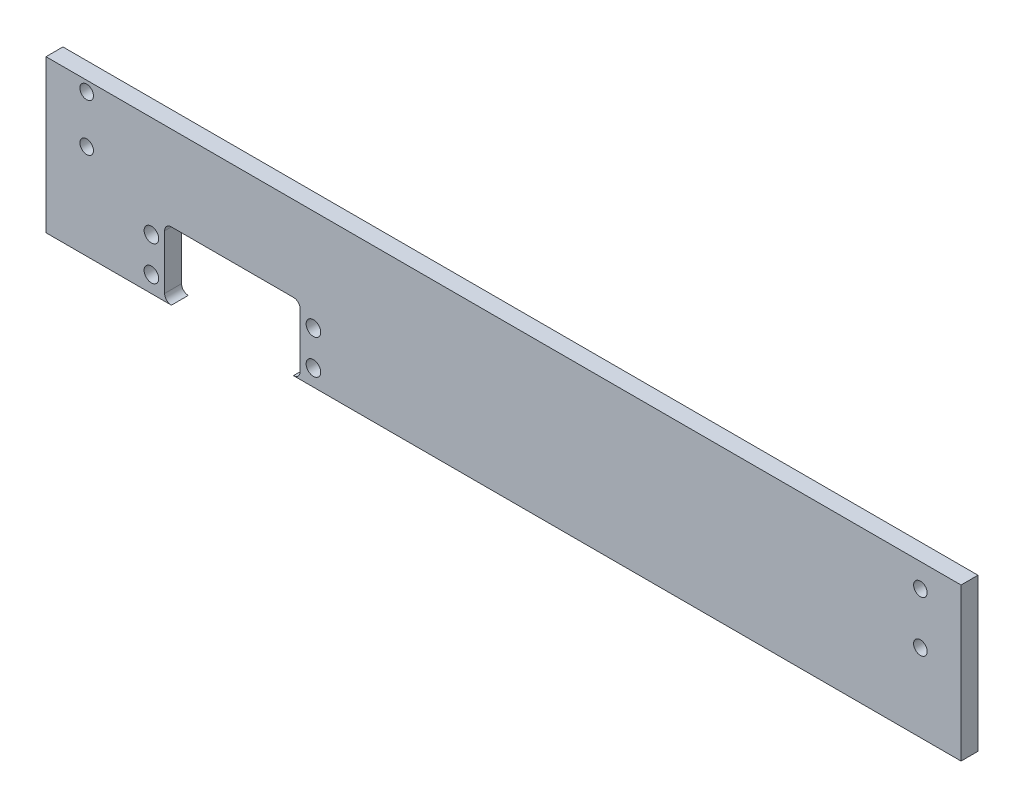
ISO-10303-21;
HEADER;
FILE_DESCRIPTION(('STEP AP214'),'2;1');
FILE_NAME('part.step','',(''),(''),'','','');
FILE_SCHEMA(('AUTOMOTIVE_DESIGN { 1 0 10303 214 1 1 1 1 }'));
ENDSEC;
DATA;
#1=APPLICATION_CONTEXT('core data for automotive mechanical design processes');
#2=APPLICATION_PROTOCOL_DEFINITION('international standard','automotive_design',2000,#1);
#3=PRODUCT_CONTEXT('',#1,'mechanical');
#4=PRODUCT('Part','Part','',(#3));
#5=PRODUCT_RELATED_PRODUCT_CATEGORY('part','',(#4));
#6=PRODUCT_DEFINITION_FORMATION('','',#4);
#7=PRODUCT_DEFINITION_CONTEXT('part definition',#1,'design');
#8=PRODUCT_DEFINITION('design','',#6,#7);
#9=PRODUCT_DEFINITION_SHAPE('','',#8);
#10=(LENGTH_UNIT() NAMED_UNIT(*) SI_UNIT(.MILLI.,.METRE.));
#11=(NAMED_UNIT(*) PLANE_ANGLE_UNIT() SI_UNIT($,.RADIAN.));
#12=(NAMED_UNIT(*) SI_UNIT($,.STERADIAN.) SOLID_ANGLE_UNIT());
#13=UNCERTAINTY_MEASURE_WITH_UNIT(LENGTH_MEASURE(1.E-05),#10,'distance_accuracy_value','');
#14=(GEOMETRIC_REPRESENTATION_CONTEXT(3) GLOBAL_UNCERTAINTY_ASSIGNED_CONTEXT((#13)) GLOBAL_UNIT_ASSIGNED_CONTEXT((#10,
#11,#12)) REPRESENTATION_CONTEXT('',''));
#15=CARTESIAN_POINT('',(0.,0.,0.));
#16=DIRECTION('',(0.,0.,1.));
#17=DIRECTION('',(1.,0.,0.));
#18=AXIS2_PLACEMENT_3D('',#15,#16,#17);
#19=CARTESIAN_POINT('',(-135.,-37.5,5.));
#20=DIRECTION('',(0.,1.,0.));
#21=DIRECTION('',(0.,0.,1.));
#22=AXIS2_PLACEMENT_3D('',#19,#20,#21);
#23=PLANE('',#22);
#24=DIRECTION('',(0.,0.,1.));
#25=VECTOR('',#24,1.);
#26=CARTESIAN_POINT('',(-62.,-37.5,0.));
#27=LINE('',#26,#25);
#28=CARTESIAN_POINT('',(-62.,-37.5,0.));
#29=VERTEX_POINT('',#28);
#30=CARTESIAN_POINT('',(-62.,-37.5,5.));
#31=VERTEX_POINT('',#30);
#32=EDGE_CURVE('E123',#29,#31,#27,.T.);
#33=ORIENTED_EDGE('',*,*,#32,.F.);
#34=DIRECTION('',(1.,0.,0.));
#35=VECTOR('',#34,1.);
#36=CARTESIAN_POINT('',(-135.,-37.5,0.));
#37=LINE('',#36,#35);
#38=CARTESIAN_POINT('',(135.,-37.5,0.));
#39=VERTEX_POINT('',#38);
#40=EDGE_CURVE('E119',#29,#39,#37,.T.);
#41=ORIENTED_EDGE('',*,*,#40,.T.);
#42=DIRECTION('',(0.,0.,-1.));
#43=VECTOR('',#42,1.);
#44=CARTESIAN_POINT('',(135.,-37.5,5.));
#45=LINE('',#44,#43);
#46=CARTESIAN_POINT('',(135.,-37.5,5.));
#47=VERTEX_POINT('',#46);
#48=EDGE_CURVE('E41',#47,#39,#45,.T.);
#49=ORIENTED_EDGE('',*,*,#48,.F.);
#50=DIRECTION('',(1.,0.,0.));
#51=VECTOR('',#50,1.);
#52=CARTESIAN_POINT('',(-135.,-37.5,5.));
#53=LINE('',#52,#51);
#54=EDGE_CURVE('E195',#31,#47,#53,.T.);
#55=ORIENTED_EDGE('',*,*,#54,.F.);
#56=EDGE_LOOP('',(#33,#41,#49,#55));
#57=FACE_BOUND('',#56,.T.);
#58=ADVANCED_FACE('F32',(#57),#23,.F.);
#59=CARTESIAN_POINT('',(135.,37.5,5.));
#60=DIRECTION('',(-1.,0.,0.));
#61=DIRECTION('',(0.,0.,1.));
#62=AXIS2_PLACEMENT_3D('',#59,#60,#61);
#63=PLANE('',#62);
#64=DIRECTION('',(0.,1.,0.));
#65=VECTOR('',#64,1.);
#66=CARTESIAN_POINT('',(135.,37.5,0.));
#67=LINE('',#66,#65);
#68=CARTESIAN_POINT('',(135.,7.50000000000001,0.));
#69=VERTEX_POINT('',#68);
#70=EDGE_CURVE('E130',#39,#69,#67,.T.);
#71=ORIENTED_EDGE('',*,*,#70,.T.);
#72=DIRECTION('',(0.,0.,-1.));
#73=VECTOR('',#72,1.);
#74=CARTESIAN_POINT('',(135.,7.50000000000001,0.));
#75=LINE('',#74,#73);
#76=CARTESIAN_POINT('',(135.,7.50000000000001,5.));
#77=VERTEX_POINT('',#76);
#78=EDGE_CURVE('E49',#77,#69,#75,.T.);
#79=ORIENTED_EDGE('',*,*,#78,.F.);
#80=DIRECTION('',(0.,1.,0.));
#81=VECTOR('',#80,1.);
#82=CARTESIAN_POINT('',(135.,37.5,5.));
#83=LINE('',#82,#81);
#84=EDGE_CURVE('E132',#47,#77,#83,.T.);
#85=ORIENTED_EDGE('',*,*,#84,.F.);
#86=ORIENTED_EDGE('',*,*,#48,.T.);
#87=EDGE_LOOP('',(#71,#79,#85,#86));
#88=FACE_BOUND('',#87,.T.);
#89=ADVANCED_FACE('F34',(#88),#63,.F.);
#90=CARTESIAN_POINT('',(-135.,37.5,5.));
#91=DIRECTION('',(1.,0.,0.));
#92=DIRECTION('',(0.,0.,-1.));
#93=AXIS2_PLACEMENT_3D('',#90,#91,#92);
#94=PLANE('',#93);
#95=DIRECTION('',(0.,-1.,0.));
#96=VECTOR('',#95,1.);
#97=CARTESIAN_POINT('',(-135.,37.5,5.));
#98=LINE('',#97,#96);
#99=CARTESIAN_POINT('',(-135.,7.50000000000001,5.));
#100=VERTEX_POINT('',#99);
#101=CARTESIAN_POINT('',(-135.,-37.5,5.));
#102=VERTEX_POINT('',#101);
#103=EDGE_CURVE('E194',#100,#102,#98,.T.);
#104=ORIENTED_EDGE('',*,*,#103,.F.);
#105=DIRECTION('',(0.,0.,1.));
#106=VECTOR('',#105,1.);
#107=CARTESIAN_POINT('',(-135.,7.50000000000001,0.));
#108=LINE('',#107,#106);
#109=CARTESIAN_POINT('',(-135.,7.50000000000001,0.));
#110=VERTEX_POINT('',#109);
#111=EDGE_CURVE('E261',#110,#100,#108,.T.);
#112=ORIENTED_EDGE('',*,*,#111,.F.);
#113=DIRECTION('',(0.,-1.,0.));
#114=VECTOR('',#113,1.);
#115=CARTESIAN_POINT('',(-135.,37.5,0.));
#116=LINE('',#115,#114);
#117=CARTESIAN_POINT('',(-135.,-37.5,0.));
#118=VERTEX_POINT('',#117);
#119=EDGE_CURVE('E114',#110,#118,#116,.T.);
#120=ORIENTED_EDGE('',*,*,#119,.T.);
#121=DIRECTION('',(0.,0.,-1.));
#122=VECTOR('',#121,1.);
#123=CARTESIAN_POINT('',(-135.,-37.5,5.));
#124=LINE('',#123,#122);
#125=EDGE_CURVE('E11',#102,#118,#124,.T.);
#126=ORIENTED_EDGE('',*,*,#125,.F.);
#127=EDGE_LOOP('',(#104,#112,#120,#126));
#128=FACE_BOUND('',#127,.T.);
#129=ADVANCED_FACE('F269',(#128),#94,.F.);
#130=CARTESIAN_POINT('',(-98.,-37.5,0.));
#131=VERTEX_POINT('',#130);
#132=EDGE_CURVE('E126',#118,#131,#37,.T.);
#133=ORIENTED_EDGE('',*,*,#132,.T.);
#134=DIRECTION('',(0.,0.,1.));
#135=VECTOR('',#134,1.);
#136=CARTESIAN_POINT('',(-98.,-37.5,0.));
#137=LINE('',#136,#135);
#138=CARTESIAN_POINT('',(-98.,-37.5,5.));
#139=VERTEX_POINT('',#138);
#140=EDGE_CURVE('E207',#131,#139,#137,.T.);
#141=ORIENTED_EDGE('',*,*,#140,.T.);
#142=EDGE_CURVE('E133',#102,#139,#53,.T.);
#143=ORIENTED_EDGE('',*,*,#142,.F.);
#144=ORIENTED_EDGE('',*,*,#125,.T.);
#145=EDGE_LOOP('',(#133,#141,#143,#144));
#146=FACE_BOUND('',#145,.T.);
#147=ADVANCED_FACE('F205',(#146),#23,.F.);
#148=CARTESIAN_POINT('',(0.,0.,5.));
#149=DIRECTION('',(0.,0.,1.));
#150=DIRECTION('',(1.,0.,0.));
#151=AXIS2_PLACEMENT_3D('',#148,#149,#150);
#152=PLANE('',#151);
#153=DIRECTION('',(1.,0.,0.));
#154=VECTOR('',#153,1.);
#155=CARTESIAN_POINT('',(135.,7.50000000000001,5.));
#156=LINE('',#155,#154);
#157=EDGE_CURVE('E257',#100,#77,#156,.T.);
#158=ORIENTED_EDGE('',*,*,#157,.F.);
#159=ORIENTED_EDGE('',*,*,#103,.T.);
#160=ORIENTED_EDGE('',*,*,#142,.T.);
#161=CARTESIAN_POINT('',(-98.,-35.5,5.));
#162=DIRECTION('',(0.,0.,1.));
#163=DIRECTION('',(1.,0.,0.));
#164=AXIS2_PLACEMENT_3D('',#161,#162,#163);
#165=CIRCLE('',#164,2.);
#166=CARTESIAN_POINT('',(-100.,-35.5,5.));
#167=VERTEX_POINT('',#166);
#168=EDGE_CURVE('E158',#167,#139,#165,.T.);
#169=ORIENTED_EDGE('',*,*,#168,.F.);
#170=DIRECTION('',(0.,1.,0.));
#171=VECTOR('',#170,1.);
#172=CARTESIAN_POINT('',(-100.,-19.5,5.));
#173=LINE('',#172,#171);
#174=CARTESIAN_POINT('',(-100.,-19.5,5.));
#175=VERTEX_POINT('',#174);
#176=EDGE_CURVE('E157',#175,#167,#173,.F.);
#177=ORIENTED_EDGE('',*,*,#176,.F.);
#178=CARTESIAN_POINT('',(-98.,-19.5,5.));
#179=DIRECTION('',(0.,0.,1.));
#180=DIRECTION('',(1.,0.,0.));
#181=AXIS2_PLACEMENT_3D('',#178,#179,#180);
#182=CIRCLE('',#181,2.);
#183=CARTESIAN_POINT('',(-98.,-17.5,5.));
#184=VERTEX_POINT('',#183);
#185=EDGE_CURVE('E155',#184,#175,#182,.T.);
#186=ORIENTED_EDGE('',*,*,#185,.F.);
#187=DIRECTION('',(-1.,0.,0.));
#188=VECTOR('',#187,1.);
#189=CARTESIAN_POINT('',(-62.,-17.5,5.));
#190=LINE('',#189,#188);
#191=CARTESIAN_POINT('',(-62.,-17.5,5.));
#192=VERTEX_POINT('',#191);
#193=EDGE_CURVE('E153',#192,#184,#190,.T.);
#194=ORIENTED_EDGE('',*,*,#193,.F.);
#195=CARTESIAN_POINT('',(-62.,-19.5,5.));
#196=DIRECTION('',(0.,0.,1.));
#197=DIRECTION('',(1.,0.,0.));
#198=AXIS2_PLACEMENT_3D('',#195,#196,#197);
#199=CIRCLE('',#198,2.00000000000001);
#200=CARTESIAN_POINT('',(-60.,-19.5,5.));
#201=VERTEX_POINT('',#200);
#202=EDGE_CURVE('E150',#201,#192,#199,.T.);
#203=ORIENTED_EDGE('',*,*,#202,.F.);
#204=DIRECTION('',(0.,1.,0.));
#205=VECTOR('',#204,1.);
#206=CARTESIAN_POINT('',(-60.,-35.5,5.));
#207=LINE('',#206,#205);
#208=CARTESIAN_POINT('',(-60.,-35.5,5.));
#209=VERTEX_POINT('',#208);
#210=EDGE_CURVE('E148',#209,#201,#207,.T.);
#211=ORIENTED_EDGE('',*,*,#210,.F.);
#212=CARTESIAN_POINT('',(-62.,-35.5,5.));
#213=DIRECTION('',(0.,0.,1.));
#214=DIRECTION('',(1.,0.,0.));
#215=AXIS2_PLACEMENT_3D('',#212,#213,#214);
#216=CIRCLE('',#215,2.);
#217=EDGE_CURVE('E36',#31,#209,#216,.T.);
#218=ORIENTED_EDGE('',*,*,#217,.F.);
#219=ORIENTED_EDGE('',*,*,#54,.T.);
#220=ORIENTED_EDGE('',*,*,#84,.T.);
#221=EDGE_LOOP('',(#158,#159,#160,#169,#177,#186,#194,#203,#211,#218,#219,#220));
#222=FACE_BOUND('',#221,.T.);
#223=CARTESIAN_POINT('',(-103.9,-22.4,5.));
#224=DIRECTION('',(0.,0.,1.));
#225=DIRECTION('',(1.,0.,0.));
#226=AXIS2_PLACEMENT_3D('',#223,#224,#225);
#227=CIRCLE('',#226,2.15);
#228=CARTESIAN_POINT('',(-101.75,-22.4,5.));
#229=VERTEX_POINT('',#228);
#230=EDGE_CURVE('E151',#229,#229,#227,.T.);
#231=ORIENTED_EDGE('',*,*,#230,.F.);
#232=EDGE_LOOP('',(#231));
#233=FACE_BOUND('',#232,.T.);
#234=CARTESIAN_POINT('',(-103.9,-32.6,5.));
#235=DIRECTION('',(0.,0.,1.));
#236=DIRECTION('',(1.,0.,0.));
#237=AXIS2_PLACEMENT_3D('',#234,#235,#236);
#238=CIRCLE('',#237,2.15);
#239=CARTESIAN_POINT('',(-101.75,-32.6,5.));
#240=VERTEX_POINT('',#239);
#241=EDGE_CURVE('E217',#240,#240,#238,.T.);
#242=ORIENTED_EDGE('',*,*,#241,.F.);
#243=EDGE_LOOP('',(#242));
#244=FACE_BOUND('',#243,.T.);
#245=CARTESIAN_POINT('',(-56.1,-22.4,5.));
#246=DIRECTION('',(0.,0.,1.));
#247=DIRECTION('',(1.,0.,0.));
#248=AXIS2_PLACEMENT_3D('',#245,#246,#247);
#249=CIRCLE('',#248,2.15);
#250=CARTESIAN_POINT('',(-53.95,-22.4,5.));
#251=VERTEX_POINT('',#250);
#252=EDGE_CURVE('E220',#251,#251,#249,.T.);
#253=ORIENTED_EDGE('',*,*,#252,.F.);
#254=EDGE_LOOP('',(#253));
#255=FACE_BOUND('',#254,.T.);
#256=CARTESIAN_POINT('',(-56.1,-32.6,5.));
#257=DIRECTION('',(0.,0.,1.));
#258=DIRECTION('',(1.,0.,0.));
#259=AXIS2_PLACEMENT_3D('',#256,#257,#258);
#260=CIRCLE('',#259,2.15);
#261=CARTESIAN_POINT('',(-53.95,-32.6,5.));
#262=VERTEX_POINT('',#261);
#263=EDGE_CURVE('E165',#262,#262,#260,.T.);
#264=ORIENTED_EDGE('',*,*,#263,.F.);
#265=EDGE_LOOP('',(#264));
#266=FACE_BOUND('',#265,.T.);
#267=CARTESIAN_POINT('',(123.,-14.5,5.));
#268=DIRECTION('',(0.,0.,1.));
#269=DIRECTION('',(1.,0.,0.));
#270=AXIS2_PLACEMENT_3D('',#267,#268,#269);
#271=CIRCLE('',#270,2.);
#272=CARTESIAN_POINT('',(125.,-14.5,5.));
#273=VERTEX_POINT('',#272);
#274=EDGE_CURVE('E178',#273,#273,#271,.T.);
#275=ORIENTED_EDGE('',*,*,#274,.F.);
#276=EDGE_LOOP('',(#275));
#277=FACE_BOUND('',#276,.T.);
#278=CARTESIAN_POINT('',(-123.,4.50000000000001,5.));
#279=DIRECTION('',(0.,0.,1.));
#280=DIRECTION('',(1.,0.,0.));
#281=AXIS2_PLACEMENT_3D('',#278,#279,#280);
#282=CIRCLE('',#281,2.);
#283=CARTESIAN_POINT('',(-121.,4.50000000000001,5.));
#284=VERTEX_POINT('',#283);
#285=EDGE_CURVE('E184',#284,#284,#282,.T.);
#286=ORIENTED_EDGE('',*,*,#285,.F.);
#287=EDGE_LOOP('',(#286));
#288=FACE_BOUND('',#287,.T.);
#289=CARTESIAN_POINT('',(-123.,-9.49999999999999,5.));
#290=DIRECTION('',(0.,0.,1.));
#291=DIRECTION('',(1.,0.,0.));
#292=AXIS2_PLACEMENT_3D('',#289,#290,#291);
#293=CIRCLE('',#292,2.);
#294=CARTESIAN_POINT('',(-121.,-9.49999999999999,5.));
#295=VERTEX_POINT('',#294);
#296=EDGE_CURVE('E170',#295,#295,#293,.T.);
#297=ORIENTED_EDGE('',*,*,#296,.F.);
#298=EDGE_LOOP('',(#297));
#299=FACE_BOUND('',#298,.T.);
#300=CARTESIAN_POINT('',(123.,0.500000000000007,5.));
#301=DIRECTION('',(0.,0.,1.));
#302=DIRECTION('',(1.,0.,0.));
#303=AXIS2_PLACEMENT_3D('',#300,#301,#302);
#304=CIRCLE('',#303,2.);
#305=CARTESIAN_POINT('',(125.,0.500000000000007,5.));
#306=VERTEX_POINT('',#305);
#307=EDGE_CURVE('E142',#306,#306,#304,.T.);
#308=ORIENTED_EDGE('',*,*,#307,.F.);
#309=EDGE_LOOP('',(#308));
#310=FACE_BOUND('',#309,.T.);
#311=ADVANCED_FACE('F201',(#222,#233,#244,#255,#266,#277,#288,#299,#310),#152,.T.);
#312=CARTESIAN_POINT('',(0.,0.,0.));
#313=DIRECTION('',(0.,0.,1.));
#314=DIRECTION('',(1.,0.,0.));
#315=AXIS2_PLACEMENT_3D('',#312,#313,#314);
#316=PLANE('',#315);
#317=ORIENTED_EDGE('',*,*,#119,.F.);
#318=DIRECTION('',(-1.,0.,0.));
#319=VECTOR('',#318,1.);
#320=CARTESIAN_POINT('',(135.,7.50000000000001,0.));
#321=LINE('',#320,#319);
#322=EDGE_CURVE('E137',#69,#110,#321,.T.);
#323=ORIENTED_EDGE('',*,*,#322,.F.);
#324=ORIENTED_EDGE('',*,*,#70,.F.);
#325=ORIENTED_EDGE('',*,*,#40,.F.);
#326=CARTESIAN_POINT('',(-62.,-35.5,0.));
#327=DIRECTION('',(0.,0.,1.));
#328=DIRECTION('',(1.,0.,0.));
#329=AXIS2_PLACEMENT_3D('',#326,#327,#328);
#330=CIRCLE('',#329,2.);
#331=CARTESIAN_POINT('',(-60.,-35.5,0.));
#332=VERTEX_POINT('',#331);
#333=EDGE_CURVE('E101',#29,#332,#330,.T.);
#334=ORIENTED_EDGE('',*,*,#333,.T.);
#335=DIRECTION('',(0.,1.,0.));
#336=VECTOR('',#335,1.);
#337=CARTESIAN_POINT('',(-60.,-35.5,0.));
#338=LINE('',#337,#336);
#339=CARTESIAN_POINT('',(-60.,-19.5,0.));
#340=VERTEX_POINT('',#339);
#341=EDGE_CURVE('E253',#332,#340,#338,.T.);
#342=ORIENTED_EDGE('',*,*,#341,.T.);
#343=CARTESIAN_POINT('',(-62.,-19.5,0.));
#344=DIRECTION('',(0.,0.,1.));
#345=DIRECTION('',(1.,0.,0.));
#346=AXIS2_PLACEMENT_3D('',#343,#344,#345);
#347=CIRCLE('',#346,2.00000000000001);
#348=CARTESIAN_POINT('',(-62.,-17.5,0.));
#349=VERTEX_POINT('',#348);
#350=EDGE_CURVE('E58',#340,#349,#347,.T.);
#351=ORIENTED_EDGE('',*,*,#350,.T.);
#352=DIRECTION('',(-1.,0.,0.));
#353=VECTOR('',#352,1.);
#354=CARTESIAN_POINT('',(-62.,-17.5,0.));
#355=LINE('',#354,#353);
#356=CARTESIAN_POINT('',(-98.,-17.5,0.));
#357=VERTEX_POINT('',#356);
#358=EDGE_CURVE('E249',#349,#357,#355,.T.);
#359=ORIENTED_EDGE('',*,*,#358,.T.);
#360=CARTESIAN_POINT('',(-98.,-19.5,0.));
#361=DIRECTION('',(0.,0.,1.));
#362=DIRECTION('',(1.,0.,0.));
#363=AXIS2_PLACEMENT_3D('',#360,#361,#362);
#364=CIRCLE('',#363,2.);
#365=CARTESIAN_POINT('',(-100.,-19.5,0.));
#366=VERTEX_POINT('',#365);
#367=EDGE_CURVE('E246',#357,#366,#364,.T.);
#368=ORIENTED_EDGE('',*,*,#367,.T.);
#369=DIRECTION('',(0.,-1.,0.));
#370=VECTOR('',#369,1.);
#371=CARTESIAN_POINT('',(-100.,-19.5,0.));
#372=LINE('',#371,#370);
#373=CARTESIAN_POINT('',(-100.,-35.5,0.));
#374=VERTEX_POINT('',#373);
#375=EDGE_CURVE('E243',#366,#374,#372,.T.);
#376=ORIENTED_EDGE('',*,*,#375,.T.);
#377=CARTESIAN_POINT('',(-98.,-35.5,0.));
#378=DIRECTION('',(0.,0.,1.));
#379=DIRECTION('',(1.,0.,0.));
#380=AXIS2_PLACEMENT_3D('',#377,#378,#379);
#381=CIRCLE('',#380,2.);
#382=EDGE_CURVE('E241',#374,#131,#381,.T.);
#383=ORIENTED_EDGE('',*,*,#382,.T.);
#384=ORIENTED_EDGE('',*,*,#132,.F.);
#385=EDGE_LOOP('',(#317,#323,#324,#325,#334,#342,#351,#359,#368,#376,#383,#384));
#386=FACE_BOUND('',#385,.T.);
#387=CARTESIAN_POINT('',(-103.9,-22.4,0.));
#388=DIRECTION('',(0.,0.,1.));
#389=DIRECTION('',(-1.,0.,0.));
#390=AXIS2_PLACEMENT_3D('',#387,#388,#389);
#391=CIRCLE('',#390,2.15);
#392=CARTESIAN_POINT('',(-106.05,-22.4,0.));
#393=VERTEX_POINT('',#392);
#394=EDGE_CURVE('E211',#393,#393,#391,.T.);
#395=ORIENTED_EDGE('',*,*,#394,.T.);
#396=EDGE_LOOP('',(#395));
#397=FACE_BOUND('',#396,.T.);
#398=CARTESIAN_POINT('',(-103.9,-32.6,0.));
#399=DIRECTION('',(0.,0.,1.));
#400=DIRECTION('',(-1.,0.,0.));
#401=AXIS2_PLACEMENT_3D('',#398,#399,#400);
#402=CIRCLE('',#401,2.15);
#403=CARTESIAN_POINT('',(-106.05,-32.6,0.));
#404=VERTEX_POINT('',#403);
#405=EDGE_CURVE('E224',#404,#404,#402,.T.);
#406=ORIENTED_EDGE('',*,*,#405,.T.);
#407=EDGE_LOOP('',(#406));
#408=FACE_BOUND('',#407,.T.);
#409=CARTESIAN_POINT('',(-56.1,-22.4,0.));
#410=DIRECTION('',(0.,0.,1.));
#411=DIRECTION('',(-1.,0.,0.));
#412=AXIS2_PLACEMENT_3D('',#409,#410,#411);
#413=CIRCLE('',#412,2.15);
#414=CARTESIAN_POINT('',(-58.25,-22.4,0.));
#415=VERTEX_POINT('',#414);
#416=EDGE_CURVE('E223',#415,#415,#413,.T.);
#417=ORIENTED_EDGE('',*,*,#416,.T.);
#418=EDGE_LOOP('',(#417));
#419=FACE_BOUND('',#418,.T.);
#420=CARTESIAN_POINT('',(-56.1,-32.6,0.));
#421=DIRECTION('',(0.,0.,1.));
#422=DIRECTION('',(-1.,0.,0.));
#423=AXIS2_PLACEMENT_3D('',#420,#421,#422);
#424=CIRCLE('',#423,2.15);
#425=CARTESIAN_POINT('',(-58.25,-32.6,0.));
#426=VERTEX_POINT('',#425);
#427=EDGE_CURVE('E163',#426,#426,#424,.T.);
#428=ORIENTED_EDGE('',*,*,#427,.T.);
#429=EDGE_LOOP('',(#428));
#430=FACE_BOUND('',#429,.T.);
#431=CARTESIAN_POINT('',(123.,-14.5,0.));
#432=DIRECTION('',(0.,0.,1.));
#433=DIRECTION('',(1.,0.,0.));
#434=AXIS2_PLACEMENT_3D('',#431,#432,#433);
#435=CIRCLE('',#434,2.);
#436=CARTESIAN_POINT('',(125.,-14.5,0.));
#437=VERTEX_POINT('',#436);
#438=EDGE_CURVE('E175',#437,#437,#435,.T.);
#439=ORIENTED_EDGE('',*,*,#438,.T.);
#440=EDGE_LOOP('',(#439));
#441=FACE_BOUND('',#440,.T.);
#442=CARTESIAN_POINT('',(-123.,4.50000000000001,0.));
#443=DIRECTION('',(0.,0.,1.));
#444=DIRECTION('',(1.,0.,0.));
#445=AXIS2_PLACEMENT_3D('',#442,#443,#444);
#446=CIRCLE('',#445,2.);
#447=CARTESIAN_POINT('',(-121.,4.50000000000001,0.));
#448=VERTEX_POINT('',#447);
#449=EDGE_CURVE('E181',#448,#448,#446,.T.);
#450=ORIENTED_EDGE('',*,*,#449,.T.);
#451=EDGE_LOOP('',(#450));
#452=FACE_BOUND('',#451,.T.);
#453=CARTESIAN_POINT('',(-123.,-9.49999999999999,0.));
#454=DIRECTION('',(0.,0.,1.));
#455=DIRECTION('',(1.,0.,0.));
#456=AXIS2_PLACEMENT_3D('',#453,#454,#455);
#457=CIRCLE('',#456,2.);
#458=CARTESIAN_POINT('',(-121.,-9.49999999999999,0.));
#459=VERTEX_POINT('',#458);
#460=EDGE_CURVE('E187',#459,#459,#457,.T.);
#461=ORIENTED_EDGE('',*,*,#460,.T.);
#462=EDGE_LOOP('',(#461));
#463=FACE_BOUND('',#462,.T.);
#464=CARTESIAN_POINT('',(123.,0.500000000000007,0.));
#465=DIRECTION('',(0.,0.,1.));
#466=DIRECTION('',(1.,0.,0.));
#467=AXIS2_PLACEMENT_3D('',#464,#465,#466);
#468=CIRCLE('',#467,2.);
#469=CARTESIAN_POINT('',(125.,0.500000000000007,0.));
#470=VERTEX_POINT('',#469);
#471=EDGE_CURVE('E138',#470,#470,#468,.T.);
#472=ORIENTED_EDGE('',*,*,#471,.T.);
#473=EDGE_LOOP('',(#472));
#474=FACE_BOUND('',#473,.T.);
#475=ADVANCED_FACE('F135',(#386,#397,#408,#419,#430,#441,#452,#463,#474),#316,.F.);
#476=CARTESIAN_POINT('',(123.,0.500000000000007,0.));
#477=DIRECTION('',(0.,0.,1.));
#478=DIRECTION('',(1.,0.,0.));
#479=AXIS2_PLACEMENT_3D('',#476,#477,#478);
#480=CYLINDRICAL_SURFACE('',#479,2.);
#481=ORIENTED_EDGE('',*,*,#471,.F.);
#482=EDGE_LOOP('',(#481));
#483=FACE_BOUND('',#482,.T.);
#484=ORIENTED_EDGE('',*,*,#307,.T.);
#485=EDGE_LOOP('',(#484));
#486=FACE_BOUND('',#485,.T.);
#487=ADVANCED_FACE('F460',(#483,#486),#480,.F.);
#488=CARTESIAN_POINT('',(-123.,-9.49999999999999,0.));
#489=DIRECTION('',(0.,0.,1.));
#490=DIRECTION('',(1.,0.,0.));
#491=AXIS2_PLACEMENT_3D('',#488,#489,#490);
#492=CYLINDRICAL_SURFACE('',#491,2.);
#493=ORIENTED_EDGE('',*,*,#460,.F.);
#494=EDGE_LOOP('',(#493));
#495=FACE_BOUND('',#494,.T.);
#496=ORIENTED_EDGE('',*,*,#296,.T.);
#497=EDGE_LOOP('',(#496));
#498=FACE_BOUND('',#497,.T.);
#499=ADVANCED_FACE('F450',(#495,#498),#492,.F.);
#500=CARTESIAN_POINT('',(-123.,4.50000000000001,0.));
#501=DIRECTION('',(0.,0.,1.));
#502=DIRECTION('',(1.,0.,0.));
#503=AXIS2_PLACEMENT_3D('',#500,#501,#502);
#504=CYLINDRICAL_SURFACE('',#503,2.);
#505=ORIENTED_EDGE('',*,*,#449,.F.);
#506=EDGE_LOOP('',(#505));
#507=FACE_BOUND('',#506,.T.);
#508=ORIENTED_EDGE('',*,*,#285,.T.);
#509=EDGE_LOOP('',(#508));
#510=FACE_BOUND('',#509,.T.);
#511=ADVANCED_FACE('F440',(#507,#510),#504,.F.);
#512=CARTESIAN_POINT('',(123.,-14.5,0.));
#513=DIRECTION('',(0.,0.,1.));
#514=DIRECTION('',(1.,0.,0.));
#515=AXIS2_PLACEMENT_3D('',#512,#513,#514);
#516=CYLINDRICAL_SURFACE('',#515,2.);
#517=ORIENTED_EDGE('',*,*,#438,.F.);
#518=EDGE_LOOP('',(#517));
#519=FACE_BOUND('',#518,.T.);
#520=ORIENTED_EDGE('',*,*,#274,.T.);
#521=EDGE_LOOP('',(#520));
#522=FACE_BOUND('',#521,.T.);
#523=ADVANCED_FACE('F419',(#519,#522),#516,.F.);
#524=CARTESIAN_POINT('',(-56.1,-32.6,0.));
#525=DIRECTION('',(0.,0.,1.));
#526=DIRECTION('',(1.,0.,0.));
#527=AXIS2_PLACEMENT_3D('',#524,#525,#526);
#528=CYLINDRICAL_SURFACE('',#527,2.15);
#529=ORIENTED_EDGE('',*,*,#263,.T.);
#530=EDGE_LOOP('',(#529));
#531=FACE_BOUND('',#530,.T.);
#532=ORIENTED_EDGE('',*,*,#427,.F.);
#533=EDGE_LOOP('',(#532));
#534=FACE_BOUND('',#533,.T.);
#535=ADVANCED_FACE('F409',(#531,#534),#528,.F.);
#536=CARTESIAN_POINT('',(-56.1,-22.4,0.));
#537=DIRECTION('',(0.,0.,1.));
#538=DIRECTION('',(1.,0.,0.));
#539=AXIS2_PLACEMENT_3D('',#536,#537,#538);
#540=CYLINDRICAL_SURFACE('',#539,2.15);
#541=ORIENTED_EDGE('',*,*,#252,.T.);
#542=EDGE_LOOP('',(#541));
#543=FACE_BOUND('',#542,.T.);
#544=ORIENTED_EDGE('',*,*,#416,.F.);
#545=EDGE_LOOP('',(#544));
#546=FACE_BOUND('',#545,.T.);
#547=ADVANCED_FACE('F398',(#543,#546),#540,.F.);
#548=CARTESIAN_POINT('',(-103.9,-32.6,0.));
#549=DIRECTION('',(0.,0.,1.));
#550=DIRECTION('',(1.,0.,0.));
#551=AXIS2_PLACEMENT_3D('',#548,#549,#550);
#552=CYLINDRICAL_SURFACE('',#551,2.15);
#553=ORIENTED_EDGE('',*,*,#241,.T.);
#554=EDGE_LOOP('',(#553));
#555=FACE_BOUND('',#554,.T.);
#556=ORIENTED_EDGE('',*,*,#405,.F.);
#557=EDGE_LOOP('',(#556));
#558=FACE_BOUND('',#557,.T.);
#559=ADVANCED_FACE('F387',(#555,#558),#552,.F.);
#560=CARTESIAN_POINT('',(-103.9,-22.4,0.));
#561=DIRECTION('',(0.,0.,1.));
#562=DIRECTION('',(1.,0.,0.));
#563=AXIS2_PLACEMENT_3D('',#560,#561,#562);
#564=CYLINDRICAL_SURFACE('',#563,2.15);
#565=ORIENTED_EDGE('',*,*,#230,.T.);
#566=EDGE_LOOP('',(#565));
#567=FACE_BOUND('',#566,.T.);
#568=ORIENTED_EDGE('',*,*,#394,.F.);
#569=EDGE_LOOP('',(#568));
#570=FACE_BOUND('',#569,.T.);
#571=ADVANCED_FACE('F378',(#567,#570),#564,.F.);
#572=CARTESIAN_POINT('',(-62.,-35.5,0.));
#573=DIRECTION('',(0.,0.,1.));
#574=DIRECTION('',(1.,0.,0.));
#575=AXIS2_PLACEMENT_3D('',#572,#573,#574);
#576=CYLINDRICAL_SURFACE('',#575,2.);
#577=ORIENTED_EDGE('',*,*,#217,.T.);
#578=DIRECTION('',(0.,0.,1.));
#579=VECTOR('',#578,1.);
#580=CARTESIAN_POINT('',(-60.,-35.5,0.));
#581=LINE('',#580,#579);
#582=EDGE_CURVE('E232',#332,#209,#581,.T.);
#583=ORIENTED_EDGE('',*,*,#582,.F.);
#584=ORIENTED_EDGE('',*,*,#333,.F.);
#585=ORIENTED_EDGE('',*,*,#32,.T.);
#586=EDGE_LOOP('',(#577,#583,#584,#585));
#587=FACE_BOUND('',#586,.T.);
#588=ADVANCED_FACE('F286',(#587),#576,.F.);
#589=CARTESIAN_POINT('',(-98.,-35.5,0.));
#590=DIRECTION('',(0.,0.,1.));
#591=DIRECTION('',(1.,0.,0.));
#592=AXIS2_PLACEMENT_3D('',#589,#590,#591);
#593=CYLINDRICAL_SURFACE('',#592,2.);
#594=ORIENTED_EDGE('',*,*,#168,.T.);
#595=ORIENTED_EDGE('',*,*,#140,.F.);
#596=ORIENTED_EDGE('',*,*,#382,.F.);
#597=DIRECTION('',(0.,0.,1.));
#598=VECTOR('',#597,1.);
#599=CARTESIAN_POINT('',(-100.,-35.5,0.));
#600=LINE('',#599,#598);
#601=EDGE_CURVE('E210',#374,#167,#600,.T.);
#602=ORIENTED_EDGE('',*,*,#601,.T.);
#603=EDGE_LOOP('',(#594,#595,#596,#602));
#604=FACE_BOUND('',#603,.T.);
#605=ADVANCED_FACE('F271',(#604),#593,.F.);
#606=CARTESIAN_POINT('',(-100.,-19.5,0.));
#607=DIRECTION('',(-1.,0.,0.));
#608=DIRECTION('',(0.,0.,1.));
#609=AXIS2_PLACEMENT_3D('',#606,#607,#608);
#610=PLANE('',#609);
#611=ORIENTED_EDGE('',*,*,#176,.T.);
#612=ORIENTED_EDGE('',*,*,#601,.F.);
#613=ORIENTED_EDGE('',*,*,#375,.F.);
#614=DIRECTION('',(0.,0.,1.));
#615=VECTOR('',#614,1.);
#616=CARTESIAN_POINT('',(-100.,-19.5,0.));
#617=LINE('',#616,#615);
#618=EDGE_CURVE('E212',#366,#175,#617,.T.);
#619=ORIENTED_EDGE('',*,*,#618,.T.);
#620=EDGE_LOOP('',(#611,#612,#613,#619));
#621=FACE_BOUND('',#620,.T.);
#622=ADVANCED_FACE('F298',(#621),#610,.F.);
#623=CARTESIAN_POINT('',(-98.,-19.5,0.));
#624=DIRECTION('',(0.,0.,1.));
#625=DIRECTION('',(1.,0.,0.));
#626=AXIS2_PLACEMENT_3D('',#623,#624,#625);
#627=CYLINDRICAL_SURFACE('',#626,2.);
#628=ORIENTED_EDGE('',*,*,#185,.T.);
#629=ORIENTED_EDGE('',*,*,#618,.F.);
#630=ORIENTED_EDGE('',*,*,#367,.F.);
#631=DIRECTION('',(0.,0.,1.));
#632=VECTOR('',#631,1.);
#633=CARTESIAN_POINT('',(-98.,-17.5,0.));
#634=LINE('',#633,#632);
#635=EDGE_CURVE('E235',#357,#184,#634,.T.);
#636=ORIENTED_EDGE('',*,*,#635,.T.);
#637=EDGE_LOOP('',(#628,#629,#630,#636));
#638=FACE_BOUND('',#637,.T.);
#639=ADVANCED_FACE('F297',(#638),#627,.F.);
#640=CARTESIAN_POINT('',(-62.,-17.5,0.));
#641=DIRECTION('',(0.,1.,0.));
#642=DIRECTION('',(-1.,0.,0.));
#643=AXIS2_PLACEMENT_3D('',#640,#641,#642);
#644=PLANE('',#643);
#645=ORIENTED_EDGE('',*,*,#193,.T.);
#646=ORIENTED_EDGE('',*,*,#635,.F.);
#647=ORIENTED_EDGE('',*,*,#358,.F.);
#648=DIRECTION('',(0.,0.,1.));
#649=VECTOR('',#648,1.);
#650=CARTESIAN_POINT('',(-62.,-17.5,0.));
#651=LINE('',#650,#649);
#652=EDGE_CURVE('E231',#349,#192,#651,.T.);
#653=ORIENTED_EDGE('',*,*,#652,.T.);
#654=EDGE_LOOP('',(#645,#646,#647,#653));
#655=FACE_BOUND('',#654,.T.);
#656=ADVANCED_FACE('F293',(#655),#644,.F.);
#657=CARTESIAN_POINT('',(-62.,-19.5,0.));
#658=DIRECTION('',(0.,0.,1.));
#659=DIRECTION('',(1.,0.,0.));
#660=AXIS2_PLACEMENT_3D('',#657,#658,#659);
#661=CYLINDRICAL_SURFACE('',#660,2.00000000000001);
#662=ORIENTED_EDGE('',*,*,#202,.T.);
#663=ORIENTED_EDGE('',*,*,#652,.F.);
#664=ORIENTED_EDGE('',*,*,#350,.F.);
#665=DIRECTION('',(0.,0.,1.));
#666=VECTOR('',#665,1.);
#667=CARTESIAN_POINT('',(-60.,-19.5,0.));
#668=LINE('',#667,#666);
#669=EDGE_CURVE('E229',#340,#201,#668,.T.);
#670=ORIENTED_EDGE('',*,*,#669,.T.);
#671=EDGE_LOOP('',(#662,#663,#664,#670));
#672=FACE_BOUND('',#671,.T.);
#673=ADVANCED_FACE('F335',(#672),#661,.F.);
#674=CARTESIAN_POINT('',(-60.,-35.5,0.));
#675=DIRECTION('',(1.,0.,0.));
#676=DIRECTION('',(0.,0.,-1.));
#677=AXIS2_PLACEMENT_3D('',#674,#675,#676);
#678=PLANE('',#677);
#679=ORIENTED_EDGE('',*,*,#210,.T.);
#680=ORIENTED_EDGE('',*,*,#669,.F.);
#681=ORIENTED_EDGE('',*,*,#341,.F.);
#682=ORIENTED_EDGE('',*,*,#582,.T.);
#683=EDGE_LOOP('',(#679,#680,#681,#682));
#684=FACE_BOUND('',#683,.T.);
#685=ADVANCED_FACE('F289',(#684),#678,.F.);
#686=CARTESIAN_POINT('',(0.,7.50000000000001,0.));
#687=DIRECTION('',(0.,-1.,0.));
#688=DIRECTION('',(0.,0.,-1.));
#689=AXIS2_PLACEMENT_3D('',#686,#687,#688);
#690=PLANE('',#689);
#691=ORIENTED_EDGE('',*,*,#78,.T.);
#692=ORIENTED_EDGE('',*,*,#322,.T.);
#693=ORIENTED_EDGE('',*,*,#111,.T.);
#694=ORIENTED_EDGE('',*,*,#157,.T.);
#695=EDGE_LOOP('',(#691,#692,#693,#694));
#696=FACE_BOUND('',#695,.T.);
#697=ADVANCED_FACE('F266',(#696),#690,.F.);
#698=CLOSED_SHELL('',(#58,#89,#129,#147,#311,#475,#487,#499,#511,#523,#535,#547,#559,#571,#588,
#605,#622,#639,#656,#673,#685,#697));
#699=MANIFOLD_SOLID_BREP('B2',#698);
#700=ADVANCED_BREP_SHAPE_REPRESENTATION('',(#18,#699),#14);
#701=SHAPE_DEFINITION_REPRESENTATION(#9,#700);
ENDSEC;
END-ISO-10303-21;
